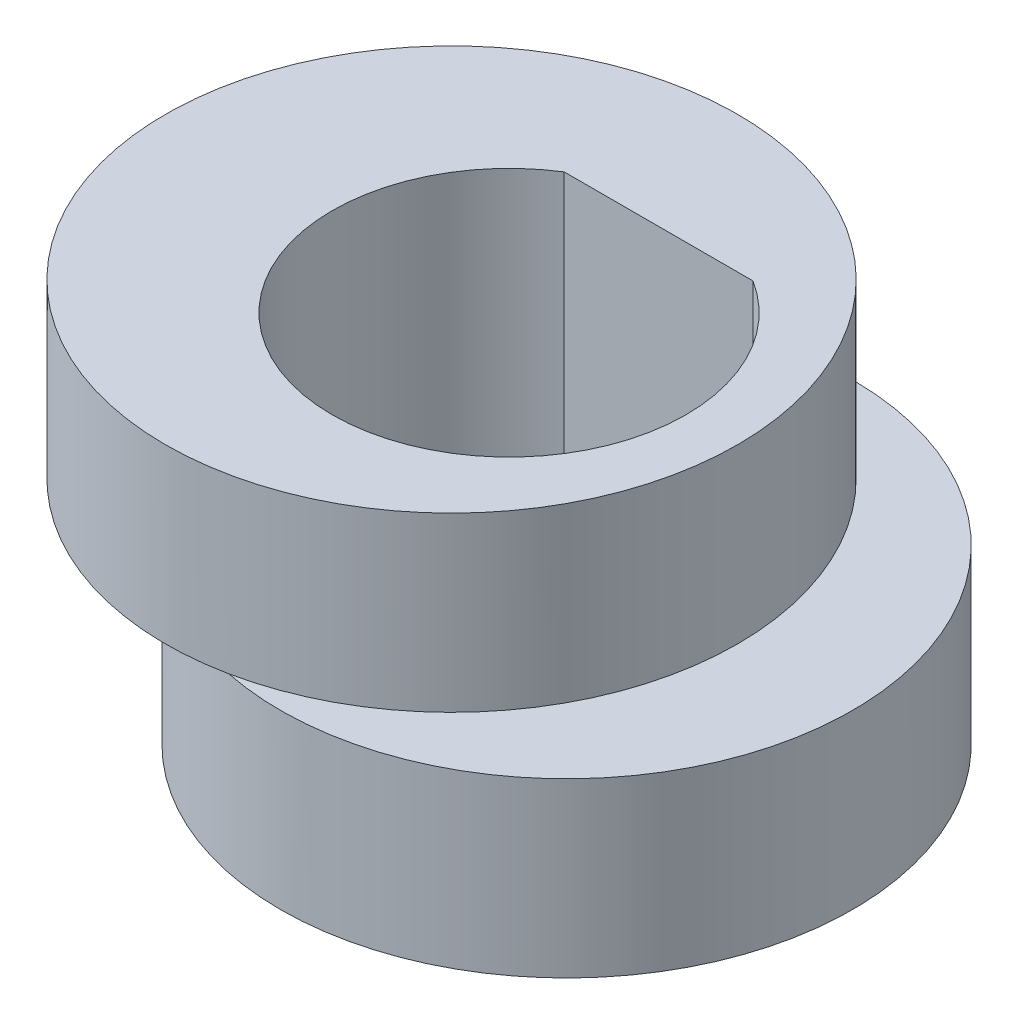
ISO-10303-21;
HEADER;
FILE_DESCRIPTION(('STEP AP214'),'2;1');
FILE_NAME('part.step','',(''),(''),'','','');
FILE_SCHEMA(('AUTOMOTIVE_DESIGN { 1 0 10303 214 1 1 1 1 }'));
ENDSEC;
DATA;
#1=APPLICATION_CONTEXT('core data for automotive mechanical design processes');
#2=APPLICATION_PROTOCOL_DEFINITION('international standard','automotive_design',2000,#1);
#3=PRODUCT_CONTEXT('',#1,'mechanical');
#4=PRODUCT('Part','Part','',(#3));
#5=PRODUCT_RELATED_PRODUCT_CATEGORY('part','',(#4));
#6=PRODUCT_DEFINITION_FORMATION('','',#4);
#7=PRODUCT_DEFINITION_CONTEXT('part definition',#1,'design');
#8=PRODUCT_DEFINITION('design','',#6,#7);
#9=PRODUCT_DEFINITION_SHAPE('','',#8);
#10=(LENGTH_UNIT() NAMED_UNIT(*) SI_UNIT(.MILLI.,.METRE.));
#11=(NAMED_UNIT(*) PLANE_ANGLE_UNIT() SI_UNIT($,.RADIAN.));
#12=(NAMED_UNIT(*) SI_UNIT($,.STERADIAN.) SOLID_ANGLE_UNIT());
#13=UNCERTAINTY_MEASURE_WITH_UNIT(LENGTH_MEASURE(1.E-05),#10,'distance_accuracy_value','');
#14=(GEOMETRIC_REPRESENTATION_CONTEXT(3) GLOBAL_UNCERTAINTY_ASSIGNED_CONTEXT((#13)) GLOBAL_UNIT_ASSIGNED_CONTEXT((#10,
#11,#12)) REPRESENTATION_CONTEXT('',''));
#15=CARTESIAN_POINT('',(0.,0.,0.));
#16=DIRECTION('',(0.,0.,1.));
#17=DIRECTION('',(1.,0.,0.));
#18=AXIS2_PLACEMENT_3D('',#15,#16,#17);
#19=CARTESIAN_POINT('',(1.,0.,0.));
#20=DIRECTION('',(0.,1.,0.));
#21=DIRECTION('',(0.,0.,1.));
#22=AXIS2_PLACEMENT_3D('',#19,#20,#21);
#23=PLANE('',#22);
#24=CARTESIAN_POINT('',(1.,0.,0.));
#25=DIRECTION('',(0.,1.,0.));
#26=DIRECTION('',(0.,0.,1.));
#27=AXIS2_PLACEMENT_3D('',#24,#25,#26);
#28=CIRCLE('',#27,4.975);
#29=CARTESIAN_POINT('',(1.,0.,4.975));
#30=VERTEX_POINT('',#29);
#31=EDGE_CURVE('E39',#30,#30,#28,.T.);
#32=ORIENTED_EDGE('',*,*,#31,.F.);
#33=EDGE_LOOP('',(#32));
#34=FACE_BOUND('',#33,.T.);
#35=CARTESIAN_POINT('',(0.,0.,0.));
#36=DIRECTION('',(0.,1.,0.));
#37=DIRECTION('',(0.,0.,1.));
#38=AXIS2_PLACEMENT_3D('',#35,#36,#37);
#39=CIRCLE('',#38,3.075);
#40=CARTESIAN_POINT('',(-1.64183586268543,0.,-2.6));
#41=VERTEX_POINT('',#40);
#42=CARTESIAN_POINT('',(1.64183586268543,0.,-2.6));
#43=VERTEX_POINT('',#42);
#44=EDGE_CURVE('E51',#41,#43,#39,.T.);
#45=ORIENTED_EDGE('',*,*,#44,.T.);
#46=DIRECTION('',(-1.,0.,0.));
#47=VECTOR('',#46,1.);
#48=CARTESIAN_POINT('',(-1.64183586268543,0.,-2.6));
#49=LINE('',#48,#47);
#50=EDGE_CURVE('E81',#43,#41,#49,.T.);
#51=ORIENTED_EDGE('',*,*,#50,.T.);
#52=EDGE_LOOP('',(#45,#51));
#53=FACE_BOUND('',#52,.T.);
#54=ADVANCED_FACE('F35',(#34,#53),#23,.F.);
#55=CARTESIAN_POINT('',(-1.,6.,0.));
#56=DIRECTION('',(0.,1.,0.));
#57=DIRECTION('',(0.,0.,1.));
#58=AXIS2_PLACEMENT_3D('',#55,#56,#57);
#59=PLANE('',#58);
#60=CARTESIAN_POINT('',(-1.,6.,0.));
#61=DIRECTION('',(0.,1.,0.));
#62=DIRECTION('',(0.,0.,1.));
#63=AXIS2_PLACEMENT_3D('',#60,#61,#62);
#64=CIRCLE('',#63,4.975);
#65=CARTESIAN_POINT('',(-1.,6.,4.975));
#66=VERTEX_POINT('',#65);
#67=EDGE_CURVE('E88',#66,#66,#64,.T.);
#68=ORIENTED_EDGE('',*,*,#67,.T.);
#69=EDGE_LOOP('',(#68));
#70=FACE_BOUND('',#69,.T.);
#71=DIRECTION('',(-1.,0.,0.));
#72=VECTOR('',#71,1.);
#73=CARTESIAN_POINT('',(-1.64183586268543,6.,-2.6));
#74=LINE('',#73,#72);
#75=CARTESIAN_POINT('',(1.64183586268543,6.,-2.6));
#76=VERTEX_POINT('',#75);
#77=CARTESIAN_POINT('',(-1.64183586268543,6.,-2.6));
#78=VERTEX_POINT('',#77);
#79=EDGE_CURVE('E70',#76,#78,#74,.T.);
#80=ORIENTED_EDGE('',*,*,#79,.F.);
#81=CARTESIAN_POINT('',(0.,6.,0.));
#82=DIRECTION('',(0.,1.,0.));
#83=DIRECTION('',(0.,0.,1.));
#84=AXIS2_PLACEMENT_3D('',#81,#82,#83);
#85=CIRCLE('',#84,3.075);
#86=EDGE_CURVE('E76',#78,#76,#85,.T.);
#87=ORIENTED_EDGE('',*,*,#86,.F.);
#88=EDGE_LOOP('',(#80,#87));
#89=FACE_BOUND('',#88,.T.);
#90=ADVANCED_FACE('F80',(#70,#89),#59,.T.);
#91=CARTESIAN_POINT('',(1.,3.,0.));
#92=DIRECTION('',(0.,-1.,0.));
#93=DIRECTION('',(0.,0.,-1.));
#94=AXIS2_PLACEMENT_3D('',#91,#92,#93);
#95=CYLINDRICAL_SURFACE('',#94,4.975);
#96=CARTESIAN_POINT('',(1.,3.,0.));
#97=DIRECTION('',(0.,1.,0.));
#98=DIRECTION('',(0.,0.,1.));
#99=AXIS2_PLACEMENT_3D('',#96,#97,#98);
#100=CIRCLE('',#99,4.975);
#101=CARTESIAN_POINT('',(0.,3.,-4.87346129562963));
#102=VERTEX_POINT('',#101);
#103=CARTESIAN_POINT('',(0.,3.,4.87346129562963));
#104=VERTEX_POINT('',#103);
#105=EDGE_CURVE('E11',#102,#104,#100,.T.);
#106=ORIENTED_EDGE('',*,*,#105,.F.);
#107=EDGE_CURVE('E44',#104,#102,#100,.T.);
#108=ORIENTED_EDGE('',*,*,#107,.F.);
#109=EDGE_LOOP('',(#106,#108));
#110=FACE_BOUND('',#109,.T.);
#111=ORIENTED_EDGE('',*,*,#31,.T.);
#112=EDGE_LOOP('',(#111));
#113=FACE_BOUND('',#112,.T.);
#114=ADVANCED_FACE('F37',(#110,#113),#95,.T.);
#115=CARTESIAN_POINT('',(1.,3.,0.));
#116=DIRECTION('',(0.,1.,0.));
#117=DIRECTION('',(0.,0.,1.));
#118=AXIS2_PLACEMENT_3D('',#115,#116,#117);
#119=PLANE('',#118);
#120=CARTESIAN_POINT('',(-1.,3.,0.));
#121=DIRECTION('',(0.,1.,0.));
#122=DIRECTION('',(0.,0.,1.));
#123=AXIS2_PLACEMENT_3D('',#120,#121,#122);
#124=CIRCLE('',#123,4.975);
#125=EDGE_CURVE('E91',#104,#102,#124,.T.);
#126=ORIENTED_EDGE('',*,*,#125,.F.);
#127=ORIENTED_EDGE('',*,*,#107,.T.);
#128=EDGE_LOOP('',(#126,#127));
#129=FACE_BOUND('',#128,.T.);
#130=ADVANCED_FACE('F104',(#129),#119,.T.);
#131=CARTESIAN_POINT('',(-1.,3.,0.));
#132=DIRECTION('',(0.,1.,0.));
#133=DIRECTION('',(0.,0.,1.));
#134=AXIS2_PLACEMENT_3D('',#131,#132,#133);
#135=PLANE('',#134);
#136=EDGE_CURVE('E87',#102,#104,#124,.T.);
#137=ORIENTED_EDGE('',*,*,#136,.F.);
#138=ORIENTED_EDGE('',*,*,#105,.T.);
#139=EDGE_LOOP('',(#137,#138));
#140=FACE_BOUND('',#139,.T.);
#141=ADVANCED_FACE('F98',(#140),#135,.F.);
#142=CARTESIAN_POINT('',(-1.,6.,0.));
#143=DIRECTION('',(0.,-1.,0.));
#144=DIRECTION('',(0.,0.,-1.));
#145=AXIS2_PLACEMENT_3D('',#142,#143,#144);
#146=CYLINDRICAL_SURFACE('',#145,4.975);
#147=ORIENTED_EDGE('',*,*,#67,.F.);
#148=EDGE_LOOP('',(#147));
#149=FACE_BOUND('',#148,.T.);
#150=ORIENTED_EDGE('',*,*,#125,.T.);
#151=ORIENTED_EDGE('',*,*,#136,.T.);
#152=EDGE_LOOP('',(#150,#151));
#153=FACE_BOUND('',#152,.T.);
#154=ADVANCED_FACE('F96',(#149,#153),#146,.T.);
#155=CARTESIAN_POINT('',(0.,6.,0.));
#156=DIRECTION('',(0.,-1.,0.));
#157=DIRECTION('',(0.,0.,-1.));
#158=AXIS2_PLACEMENT_3D('',#155,#156,#157);
#159=CYLINDRICAL_SURFACE('',#158,3.075);
#160=ORIENTED_EDGE('',*,*,#44,.F.);
#161=DIRECTION('',(0.,-1.,0.));
#162=VECTOR('',#161,1.);
#163=CARTESIAN_POINT('',(-1.64183586268543,6.,-2.6));
#164=LINE('',#163,#162);
#165=EDGE_CURVE('E72',#78,#41,#164,.T.);
#166=ORIENTED_EDGE('',*,*,#165,.F.);
#167=ORIENTED_EDGE('',*,*,#86,.T.);
#168=DIRECTION('',(0.,-1.,0.));
#169=VECTOR('',#168,1.);
#170=CARTESIAN_POINT('',(1.64183586268543,6.,-2.6));
#171=LINE('',#170,#169);
#172=EDGE_CURVE('E58',#76,#43,#171,.T.);
#173=ORIENTED_EDGE('',*,*,#172,.T.);
#174=EDGE_LOOP('',(#160,#166,#167,#173));
#175=FACE_BOUND('',#174,.T.);
#176=ADVANCED_FACE('F78',(#175),#159,.F.);
#177=CARTESIAN_POINT('',(-1.64183586268543,6.,-2.6));
#178=DIRECTION('',(0.,0.,1.));
#179=DIRECTION('',(1.,0.,0.));
#180=AXIS2_PLACEMENT_3D('',#177,#178,#179);
#181=PLANE('',#180);
#182=ORIENTED_EDGE('',*,*,#50,.F.);
#183=ORIENTED_EDGE('',*,*,#172,.F.);
#184=ORIENTED_EDGE('',*,*,#79,.T.);
#185=ORIENTED_EDGE('',*,*,#165,.T.);
#186=EDGE_LOOP('',(#182,#183,#184,#185));
#187=FACE_BOUND('',#186,.T.);
#188=ADVANCED_FACE('F71',(#187),#181,.T.);
#189=CLOSED_SHELL('',(#54,#90,#114,#130,#141,#154,#176,#188));
#190=MANIFOLD_SOLID_BREP('B2',#189);
#191=ADVANCED_BREP_SHAPE_REPRESENTATION('',(#18,#190),#14);
#192=SHAPE_DEFINITION_REPRESENTATION(#9,#191);
ENDSEC;
END-ISO-10303-21;
